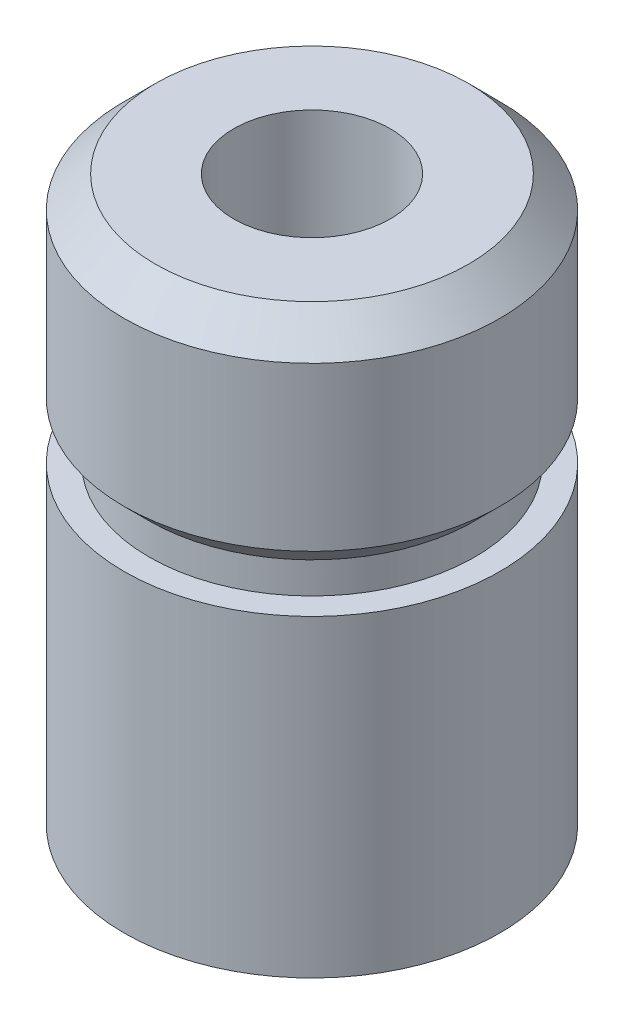
ISO-10303-21;
HEADER;
FILE_DESCRIPTION(('STEP AP214'),'2;1');
FILE_NAME('part.step','',(''),(''),'','','');
FILE_SCHEMA(('AUTOMOTIVE_DESIGN { 1 0 10303 214 1 1 1 1 }'));
ENDSEC;
DATA;
#1=APPLICATION_CONTEXT('core data for automotive mechanical design processes');
#2=APPLICATION_PROTOCOL_DEFINITION('international standard','automotive_design',2000,#1);
#3=PRODUCT_CONTEXT('',#1,'mechanical');
#4=PRODUCT('Part','Part','',(#3));
#5=PRODUCT_RELATED_PRODUCT_CATEGORY('part','',(#4));
#6=PRODUCT_DEFINITION_FORMATION('','',#4);
#7=PRODUCT_DEFINITION_CONTEXT('part definition',#1,'design');
#8=PRODUCT_DEFINITION('design','',#6,#7);
#9=PRODUCT_DEFINITION_SHAPE('','',#8);
#10=(LENGTH_UNIT() NAMED_UNIT(*) SI_UNIT(.MILLI.,.METRE.));
#11=(NAMED_UNIT(*) PLANE_ANGLE_UNIT() SI_UNIT($,.RADIAN.));
#12=(NAMED_UNIT(*) SI_UNIT($,.STERADIAN.) SOLID_ANGLE_UNIT());
#13=UNCERTAINTY_MEASURE_WITH_UNIT(LENGTH_MEASURE(1.E-05),#10,'distance_accuracy_value','');
#14=(GEOMETRIC_REPRESENTATION_CONTEXT(3) GLOBAL_UNCERTAINTY_ASSIGNED_CONTEXT((#13)) GLOBAL_UNIT_ASSIGNED_CONTEXT((#10,
#11,#12)) REPRESENTATION_CONTEXT('',''));
#15=CARTESIAN_POINT('',(0.,0.,0.));
#16=DIRECTION('',(0.,0.,1.));
#17=DIRECTION('',(1.,0.,0.));
#18=AXIS2_PLACEMENT_3D('',#15,#16,#17);
#19=CARTESIAN_POINT('',(0.,9.,0.));
#20=DIRECTION('',(0.,-1.,0.));
#21=DIRECTION('',(0.,0.,-1.));
#22=AXIS2_PLACEMENT_3D('',#19,#20,#21);
#23=CYLINDRICAL_SURFACE('',#22,3.);
#24=DIRECTION('',(0.,-1.,0.));
#25=VECTOR('',#24,1.);
#26=CARTESIAN_POINT('',(-0.226017558539806,9.001,-2.99147389479362));
#27=LINE('',#26,#25);
#28=CARTESIAN_POINT('',(-0.226017558539806,8.5,-2.99147389479362));
#29=VERTEX_POINT('',#28);
#30=CARTESIAN_POINT('',(-0.226017558539806,5.9,-2.99147389479362));
#31=VERTEX_POINT('',#30);
#32=EDGE_CURVE('E185',#29,#31,#27,.T.);
#33=ORIENTED_EDGE('',*,*,#32,.T.);
#34=CARTESIAN_POINT('',(0.,5.9,0.));
#35=DIRECTION('',(0.,-1.,0.));
#36=DIRECTION('',(0.,0.,-1.));
#37=AXIS2_PLACEMENT_3D('',#34,#35,#36);
#38=CIRCLE('',#37,3.);
#39=CARTESIAN_POINT('',(0.226017558539806,5.9,-2.99147389479362));
#40=VERTEX_POINT('',#39);
#41=EDGE_CURVE('E109',#31,#40,#38,.F.);
#42=ORIENTED_EDGE('',*,*,#41,.T.);
#43=DIRECTION('',(0.,-1.,0.));
#44=VECTOR('',#43,1.);
#45=CARTESIAN_POINT('',(0.226017558539806,9.001,-2.99147389479362));
#46=LINE('',#45,#44);
#47=CARTESIAN_POINT('',(0.226017558539806,8.5,-2.99147389479362));
#48=VERTEX_POINT('',#47);
#49=EDGE_CURVE('E171',#48,#40,#46,.T.);
#50=ORIENTED_EDGE('',*,*,#49,.F.);
#51=CARTESIAN_POINT('',(0.,8.5,0.));
#52=DIRECTION('',(0.,1.,0.));
#53=DIRECTION('',(0.,0.,1.));
#54=AXIS2_PLACEMENT_3D('',#51,#52,#53);
#55=CIRCLE('',#54,3.);
#56=EDGE_CURVE('E106',#48,#29,#55,.F.);
#57=ORIENTED_EDGE('',*,*,#56,.T.);
#58=EDGE_LOOP('',(#33,#42,#50,#57));
#59=FACE_BOUND('',#58,.T.);
#60=ADVANCED_FACE('F37',(#59),#23,.T.);
#61=CARTESIAN_POINT('',(0.,9.,0.));
#62=DIRECTION('',(0.,-1.,0.));
#63=DIRECTION('',(0.,0.,-1.));
#64=AXIS2_PLACEMENT_3D('',#61,#62,#63);
#65=CONICAL_SURFACE('',#64,2.5,0.785398163397447);
#66=CARTESIAN_POINT('',(0.,9.,0.));
#67=DIRECTION('',(0.,1.,0.));
#68=DIRECTION('',(0.,0.,1.));
#69=AXIS2_PLACEMENT_3D('',#66,#67,#68);
#70=CIRCLE('',#69,2.5);
#71=CARTESIAN_POINT('',(0.,9.,2.5));
#72=VERTEX_POINT('',#71);
#73=EDGE_CURVE('E103',#72,#72,#70,.T.);
#74=ORIENTED_EDGE('',*,*,#73,.F.);
#75=EDGE_LOOP('',(#74));
#76=FACE_BOUND('',#75,.T.);
#77=CARTESIAN_POINT('',(-0.026808033985497,8.94629216181799,-2.55356712308609));
#78=CARTESIAN_POINT('',(-0.0178991252324255,8.93095456685429,-2.56899780568631));
#79=CARTESIAN_POINT('',(-0.00900176426312327,8.91559010295012,-2.58440848693843));
#80=CARTESIAN_POINT('',(0.0760105542023887,8.76835791364869,-2.73165414179067));
#81=CARTESIAN_POINT('',(0.151324411317579,8.63463404393209,-2.86210156883385));
#82=CARTESIAN_POINT('',(0.226130020660093,8.49979728910649,-2.99166868489988));
#83=CARTESIAN_POINT('',(0.226131524626972,8.49979457821252,-2.99167128984693));
#84=CARTESIAN_POINT('',(0.309667821748201,8.34922070910527,-3.13636040072997));
#85=CARTESIAN_POINT('',(0.392566932580736,8.19726511519881,-3.2799458725697));
#86=CARTESIAN_POINT('',(0.475054668055597,8.04437189181474,-3.42281882144507));
#87=B_SPLINE_CURVE_WITH_KNOTS('',3,(#77,#78,#79,#80,#81,#82,#83,#84,#85,#86),.UNSPECIFIED.,.F.,
.F.,(4,2,2,2,4),(0.,0.0705298482518347,0.674736372631487,0.674748520450391,1.3494746015064),.UNSPECIFIED.);
#88=CARTESIAN_POINT('',(0.0249999999999545,8.85658050907852,-2.64330127018914));
#89=VERTEX_POINT('',#88);
#90=EDGE_CURVE('E177',#89,#48,#87,.T.);
#91=ORIENTED_EDGE('',*,*,#90,.F.);
#92=CARTESIAN_POINT('',(0.0249999999999997,8.85658050907852,-2.64330127018922));
#93=CARTESIAN_POINT('',(0.0166666666666663,8.85665932290004,-2.64330127018922));
#94=CARTESIAN_POINT('',(0.00833333333333303,8.85669872981079,-2.64330127018922));
#95=CARTESIAN_POINT('',(-0.00833333333333358,8.85669872981076,-2.64330127018922));
#96=CARTESIAN_POINT('',(-0.0166666666666669,8.85665932289999,-2.64330127018922));
#97=CARTESIAN_POINT('',(-0.0250000000000001,8.85658050907845,-2.64330127018922));
#98=B_SPLINE_CURVE_WITH_KNOTS('',3,(#92,#93,#94,#95,#96,#97),.UNSPECIFIED.,.F.,.F.,(4,2,4),(0.,
0.0250002795212679,0.0500005590425363),.UNSPECIFIED.);
#99=CARTESIAN_POINT('',(-0.0249999999999895,8.85658050907846,-2.6433012701892));
#100=VERTEX_POINT('',#99);
#101=EDGE_CURVE('E11',#89,#100,#98,.T.);
#102=ORIENTED_EDGE('',*,*,#101,.T.);
#103=CARTESIAN_POINT('',(-0.226133028593644,8.49979186731811,-2.99167389479362));
#104=CARTESIAN_POINT('',(-0.207430968394511,8.5335014316514,-2.95928097632251));
#105=CARTESIAN_POINT('',(-0.188696623472822,8.5671395130029,-2.92683213907162));
#106=CARTESIAN_POINT('',(-0.151155447896498,8.63425162886449,-2.86180891559756));
#107=CARTESIAN_POINT('',(-0.132348619008475,8.6677256673281,-2.82923453243425));
#108=CARTESIAN_POINT('',(-0.0946535615133307,8.73449041536959,-2.76394477765843));
#109=CARTESIAN_POINT('',(-0.0757653325068559,8.76778112404621,-2.73122940535422));
#110=CARTESIAN_POINT('',(-0.0378966263774212,8.8341538194149,-2.66563888232115));
#111=CARTESIAN_POINT('',(-0.0189161470292137,8.86723580102741,-2.63276372773804));
#112=CARTESIAN_POINT('',(0.000115470053836749,8.9001999974357,-2.5998));
#113=B_SPLINE_CURVE_WITH_KNOTS('',3,(#103,#104,#105,#106,#107,#108,#109,#110,#111,#112),
.UNSPECIFIED.,.F.,.F.,(4,2,2,2,4),(0.,0.151058418615507,0.302113178559521,0.453168680432836,
0.604227844307743),.UNSPECIFIED.);
#114=EDGE_CURVE('E164',#29,#100,#113,.T.);
#115=ORIENTED_EDGE('',*,*,#114,.F.);
#116=ORIENTED_EDGE('',*,*,#56,.F.);
#117=EDGE_LOOP('',(#91,#102,#115,#116));
#118=FACE_BOUND('',#117,.T.);
#119=ADVANCED_FACE('F121',(#76,#118),#65,.T.);
#120=CARTESIAN_POINT('',(0.,5.9,0.));
#121=DIRECTION('',(0.,1.,0.));
#122=DIRECTION('',(0.,0.,1.));
#123=AXIS2_PLACEMENT_3D('',#120,#121,#122);
#124=CONICAL_SURFACE('',#123,3.,0.785398163397451);
#125=CARTESIAN_POINT('',(0.,5.5,0.));
#126=DIRECTION('',(0.,1.,0.));
#127=DIRECTION('',(0.,0.,1.));
#128=AXIS2_PLACEMENT_3D('',#125,#126,#127);
#129=CIRCLE('',#128,2.6);
#130=CARTESIAN_POINT('',(0.,5.5,-2.6));
#131=VERTEX_POINT('',#130);
#132=EDGE_CURVE('E83',#131,#131,#129,.T.);
#133=ORIENTED_EDGE('',*,*,#132,.T.);
#134=EDGE_LOOP('',(#133));
#135=FACE_BOUND('',#134,.T.);
#136=ORIENTED_EDGE('',*,*,#41,.F.);
#137=CARTESIAN_POINT('',(0.000146836058342352,5.49974567663328,-2.59974567248657));
#138=CARTESIAN_POINT('',(0.0001363812017878,5.49976378438687,-2.59976378082931));
#139=CARTESIAN_POINT('',(0.000125926360465876,5.49978189217577,-2.59978188914566));
#140=CARTESIAN_POINT('',(-0.0760082351704287,5.63164673647773,-2.73165012510882));
#141=CARTESIAN_POINT('',(-0.151324410806378,5.76536595525028,-2.86210156794005));
#142=CARTESIAN_POINT('',(-0.226130020660093,5.90020271089351,-2.99166868489988));
#143=CARTESIAN_POINT('',(-0.226131524626973,5.90020542178747,-2.99167128984693));
#144=CARTESIAN_POINT('',(-0.300947492540386,6.03506092973954,-3.12125634749243));
#145=CARTESIAN_POINT('',(-0.375249747989287,6.17102885558659,-3.24995162905342));
#146=CARTESIAN_POINT('',(-0.44920677652682,6.30778542525254,-3.37804896004869));
#147=B_SPLINE_CURVE_WITH_KNOTS('',3,(#137,#138,#139,#140,#141,#142,#143,#144,#145,#146),
.UNSPECIFIED.,.F.,.F.,(4,2,2,2,4),(0.,8.29816945240944E-05,0.604289509991039,0.604301657809946,
1.20859201640177),.UNSPECIFIED.);
#148=CARTESIAN_POINT('',(-0.0249999999999545,5.54341949092147,-2.64330127018914));
#149=VERTEX_POINT('',#148);
#150=EDGE_CURVE('E159',#149,#31,#147,.T.);
#151=ORIENTED_EDGE('',*,*,#150,.F.);
#152=CARTESIAN_POINT('',(-0.0249999999999997,5.54341949092147,-2.64330127018922));
#153=CARTESIAN_POINT('',(-0.0166666666666664,5.54334067709996,-2.64330127018922));
#154=CARTESIAN_POINT('',(-0.00833333333333306,5.54330127018921,-2.64330127018922));
#155=CARTESIAN_POINT('',(0.00833333333333355,5.54330127018924,-2.64330127018922));
#156=CARTESIAN_POINT('',(0.0166666666666669,5.54334067710001,-2.64330127018922));
#157=CARTESIAN_POINT('',(0.0250000000000001,5.54341949092155,-2.64330127018922));
#158=B_SPLINE_CURVE_WITH_KNOTS('',3,(#152,#153,#154,#155,#156,#157),.UNSPECIFIED.,.F.,.F.,(4,2,
4),(0.,0.0250002795212679,0.0500005590425363),.UNSPECIFIED.);
#159=CARTESIAN_POINT('',(0.0249999999999894,5.54341949092153,-2.6433012701892));
#160=VERTEX_POINT('',#159);
#161=EDGE_CURVE('E50',#149,#160,#158,.T.);
#162=ORIENTED_EDGE('',*,*,#161,.T.);
#163=CARTESIAN_POINT('',(0.226133028593644,5.90020813268189,-2.99167389479362));
#164=CARTESIAN_POINT('',(0.207430968273263,5.86649856813007,-2.9592809761125));
#165=CARTESIAN_POINT('',(0.188696623229912,5.83286048656096,-2.92683213865089));
#166=CARTESIAN_POINT('',(0.151155447409276,5.76574837026641,-2.86180891475367));
#167=CARTESIAN_POINT('',(0.132348618398602,5.73227433158745,-2.82923453137792));
#168=CARTESIAN_POINT('',(0.0946535606569823,5.66550958311792,-2.7639447761752));
#169=CARTESIAN_POINT('',(0.0757653315266821,5.63221887422861,-2.73122940365651));
#170=CARTESIAN_POINT('',(0.0378966251481821,5.56584617843778,-2.66563888019204));
#171=CARTESIAN_POINT('',(0.0189161456747345,5.53276419661583,-2.63276372539201));
#172=CARTESIAN_POINT('',(-0.000115471534374356,5.4998,-2.59979999743564));
#173=B_SPLINE_CURVE_WITH_KNOTS('',3,(#163,#164,#165,#166,#167,#168,#169,#170,#171,#172),
.UNSPECIFIED.,.F.,.F.,(4,2,2,2,4),(0.,0.151058419594807,0.302113180518036,0.453168683370589,
0.604227848224817),.UNSPECIFIED.);
#174=EDGE_CURVE('E57',#40,#160,#173,.T.);
#175=ORIENTED_EDGE('',*,*,#174,.F.);
#176=EDGE_LOOP('',(#136,#151,#162,#175));
#177=FACE_BOUND('',#176,.T.);
#178=ADVANCED_FACE('F84',(#135,#177),#124,.T.);
#179=CARTESIAN_POINT('',(0.,0.,0.));
#180=DIRECTION('',(0.,1.,0.));
#181=DIRECTION('',(0.,0.,1.));
#182=AXIS2_PLACEMENT_3D('',#179,#180,#181);
#183=CIRCLE('',#182,3.);
#184=CARTESIAN_POINT('',(0.,0.,3.));
#185=VERTEX_POINT('',#184);
#186=EDGE_CURVE('E100',#185,#185,#183,.T.);
#187=ORIENTED_EDGE('',*,*,#186,.T.);
#188=EDGE_LOOP('',(#187));
#189=FACE_BOUND('',#188,.T.);
#190=CARTESIAN_POINT('',(0.,5.,0.));
#191=DIRECTION('',(0.,1.,0.));
#192=DIRECTION('',(0.,0.,1.));
#193=AXIS2_PLACEMENT_3D('',#190,#191,#192);
#194=CIRCLE('',#193,3.);
#195=CARTESIAN_POINT('',(0.,5.,3.));
#196=VERTEX_POINT('',#195);
#197=EDGE_CURVE('E91',#196,#196,#194,.T.);
#198=ORIENTED_EDGE('',*,*,#197,.F.);
#199=EDGE_LOOP('',(#198));
#200=FACE_BOUND('',#199,.T.);
#201=ADVANCED_FACE('F120',(#189,#200),#23,.T.);
#202=CARTESIAN_POINT('',(0.,0.,0.));
#203=DIRECTION('',(0.,1.,0.));
#204=DIRECTION('',(0.,0.,1.));
#205=AXIS2_PLACEMENT_3D('',#202,#203,#204);
#206=PLANE('',#205);
#207=CARTESIAN_POINT('',(0.,0.,0.));
#208=DIRECTION('',(0.,1.,0.));
#209=DIRECTION('',(0.,0.,1.));
#210=AXIS2_PLACEMENT_3D('',#207,#208,#209);
#211=CIRCLE('',#210,1.25);
#212=CARTESIAN_POINT('',(0.,0.,1.25));
#213=VERTEX_POINT('',#212);
#214=EDGE_CURVE('E88',#213,#213,#211,.T.);
#215=ORIENTED_EDGE('',*,*,#214,.T.);
#216=EDGE_LOOP('',(#215));
#217=FACE_BOUND('',#216,.T.);
#218=ORIENTED_EDGE('',*,*,#186,.F.);
#219=EDGE_LOOP('',(#218));
#220=FACE_BOUND('',#219,.T.);
#221=ADVANCED_FACE('F128',(#217,#220),#206,.F.);
#222=CARTESIAN_POINT('',(3.,5.,0.));
#223=DIRECTION('',(0.,1.,0.));
#224=DIRECTION('',(0.,0.,1.));
#225=AXIS2_PLACEMENT_3D('',#222,#223,#224);
#226=PLANE('',#225);
#227=ORIENTED_EDGE('',*,*,#197,.T.);
#228=EDGE_LOOP('',(#227));
#229=FACE_BOUND('',#228,.T.);
#230=CARTESIAN_POINT('',(0.,5.,0.));
#231=DIRECTION('',(0.,1.,0.));
#232=DIRECTION('',(0.,0.,1.));
#233=AXIS2_PLACEMENT_3D('',#230,#231,#232);
#234=CIRCLE('',#233,2.6);
#235=CARTESIAN_POINT('',(0.,5.,2.6));
#236=VERTEX_POINT('',#235);
#237=EDGE_CURVE('E87',#236,#236,#234,.T.);
#238=ORIENTED_EDGE('',*,*,#237,.F.);
#239=EDGE_LOOP('',(#238));
#240=FACE_BOUND('',#239,.T.);
#241=ADVANCED_FACE('F132',(#229,#240),#226,.T.);
#242=CARTESIAN_POINT('',(0.,9.,0.));
#243=DIRECTION('',(0.,1.,0.));
#244=DIRECTION('',(0.,0.,1.));
#245=AXIS2_PLACEMENT_3D('',#242,#243,#244);
#246=CYLINDRICAL_SURFACE('',#245,2.6);
#247=ORIENTED_EDGE('',*,*,#237,.T.);
#248=EDGE_LOOP('',(#247));
#249=FACE_BOUND('',#248,.T.);
#250=ORIENTED_EDGE('',*,*,#132,.F.);
#251=EDGE_LOOP('',(#250));
#252=FACE_BOUND('',#251,.T.);
#253=ADVANCED_FACE('F138',(#249,#252),#246,.T.);
#254=CARTESIAN_POINT('',(0.,9.,0.));
#255=DIRECTION('',(0.,1.,0.));
#256=DIRECTION('',(0.,0.,1.));
#257=AXIS2_PLACEMENT_3D('',#254,#255,#256);
#258=PLANE('',#257);
#259=CARTESIAN_POINT('',(0.,9.,0.));
#260=DIRECTION('',(0.,1.,0.));
#261=DIRECTION('',(0.,0.,1.));
#262=AXIS2_PLACEMENT_3D('',#259,#260,#261);
#263=CIRCLE('',#262,1.25);
#264=CARTESIAN_POINT('',(0.,9.,1.25));
#265=VERTEX_POINT('',#264);
#266=EDGE_CURVE('E94',#265,#265,#263,.T.);
#267=ORIENTED_EDGE('',*,*,#266,.F.);
#268=EDGE_LOOP('',(#267));
#269=FACE_BOUND('',#268,.T.);
#270=ORIENTED_EDGE('',*,*,#73,.T.);
#271=EDGE_LOOP('',(#270));
#272=FACE_BOUND('',#271,.T.);
#273=ADVANCED_FACE('F134',(#269,#272),#258,.T.);
#274=CARTESIAN_POINT('',(0.,0.,0.));
#275=DIRECTION('',(0.,1.,0.));
#276=DIRECTION('',(0.,0.,1.));
#277=AXIS2_PLACEMENT_3D('',#274,#275,#276);
#278=CYLINDRICAL_SURFACE('',#277,1.25);
#279=ORIENTED_EDGE('',*,*,#214,.F.);
#280=EDGE_LOOP('',(#279));
#281=FACE_BOUND('',#280,.T.);
#282=ORIENTED_EDGE('',*,*,#266,.T.);
#283=EDGE_LOOP('',(#282));
#284=FACE_BOUND('',#283,.T.);
#285=ADVANCED_FACE('F137',(#281,#284),#278,.F.);
#286=CARTESIAN_POINT('',(-0.226017558539806,9.001,-2.99147389479362));
#287=DIRECTION('',(0.866025403784439,0.,-0.499999999999999));
#288=DIRECTION('',(-0.499999999999999,0.,-0.86602540378444));
#289=AXIS2_PLACEMENT_3D('',#286,#287,#288);
#290=PLANE('',#289);
#291=ORIENTED_EDGE('',*,*,#114,.T.);
#292=DIRECTION('',(0.,-1.,0.));
#293=VECTOR('',#292,1.);
#294=CARTESIAN_POINT('',(-0.0249999999999997,5.5,-2.64330127018922));
#295=LINE('',#294,#293);
#296=EDGE_CURVE('E112',#100,#149,#295,.T.);
#297=ORIENTED_EDGE('',*,*,#296,.T.);
#298=ORIENTED_EDGE('',*,*,#150,.T.);
#299=ORIENTED_EDGE('',*,*,#32,.F.);
#300=EDGE_LOOP('',(#291,#297,#298,#299));
#301=FACE_BOUND('',#300,.T.);
#302=ADVANCED_FACE('F148',(#301),#290,.T.);
#303=CARTESIAN_POINT('',(0.,9.001,-2.6));
#304=DIRECTION('',(-0.86602540378444,0.,-0.499999999999998));
#305=DIRECTION('',(-0.499999999999998,0.,0.86602540378444));
#306=AXIS2_PLACEMENT_3D('',#303,#304,#305);
#307=PLANE('',#306);
#308=ORIENTED_EDGE('',*,*,#174,.T.);
#309=DIRECTION('',(0.,1.,0.));
#310=VECTOR('',#309,1.);
#311=CARTESIAN_POINT('',(0.0249999999999997,8.9,-2.64330127018922));
#312=LINE('',#311,#310);
#313=EDGE_CURVE('E62',#160,#89,#312,.T.);
#314=ORIENTED_EDGE('',*,*,#313,.T.);
#315=ORIENTED_EDGE('',*,*,#90,.T.);
#316=ORIENTED_EDGE('',*,*,#49,.T.);
#317=EDGE_LOOP('',(#308,#314,#315,#316));
#318=FACE_BOUND('',#317,.T.);
#319=ADVANCED_FACE('F153',(#318),#307,.T.);
#320=CARTESIAN_POINT('',(-0.0249999999999998,9.001,-2.64330127018922));
#321=DIRECTION('',(0.,0.,-1.));
#322=DIRECTION('',(0.,1.,0.));
#323=AXIS2_PLACEMENT_3D('',#320,#321,#322);
#324=PLANE('',#323);
#325=ORIENTED_EDGE('',*,*,#101,.F.);
#326=ORIENTED_EDGE('',*,*,#313,.F.);
#327=ORIENTED_EDGE('',*,*,#161,.F.);
#328=ORIENTED_EDGE('',*,*,#296,.F.);
#329=EDGE_LOOP('',(#325,#326,#327,#328));
#330=FACE_BOUND('',#329,.T.);
#331=ADVANCED_FACE('F39',(#330),#324,.T.);
#332=CLOSED_SHELL('',(#60,#119,#178,#201,#221,#241,#253,#273,#285,#302,#319,#331));
#333=MANIFOLD_SOLID_BREP('B2',#332);
#334=ADVANCED_BREP_SHAPE_REPRESENTATION('',(#18,#333),#14);
#335=SHAPE_DEFINITION_REPRESENTATION(#9,#334);
ENDSEC;
END-ISO-10303-21;
